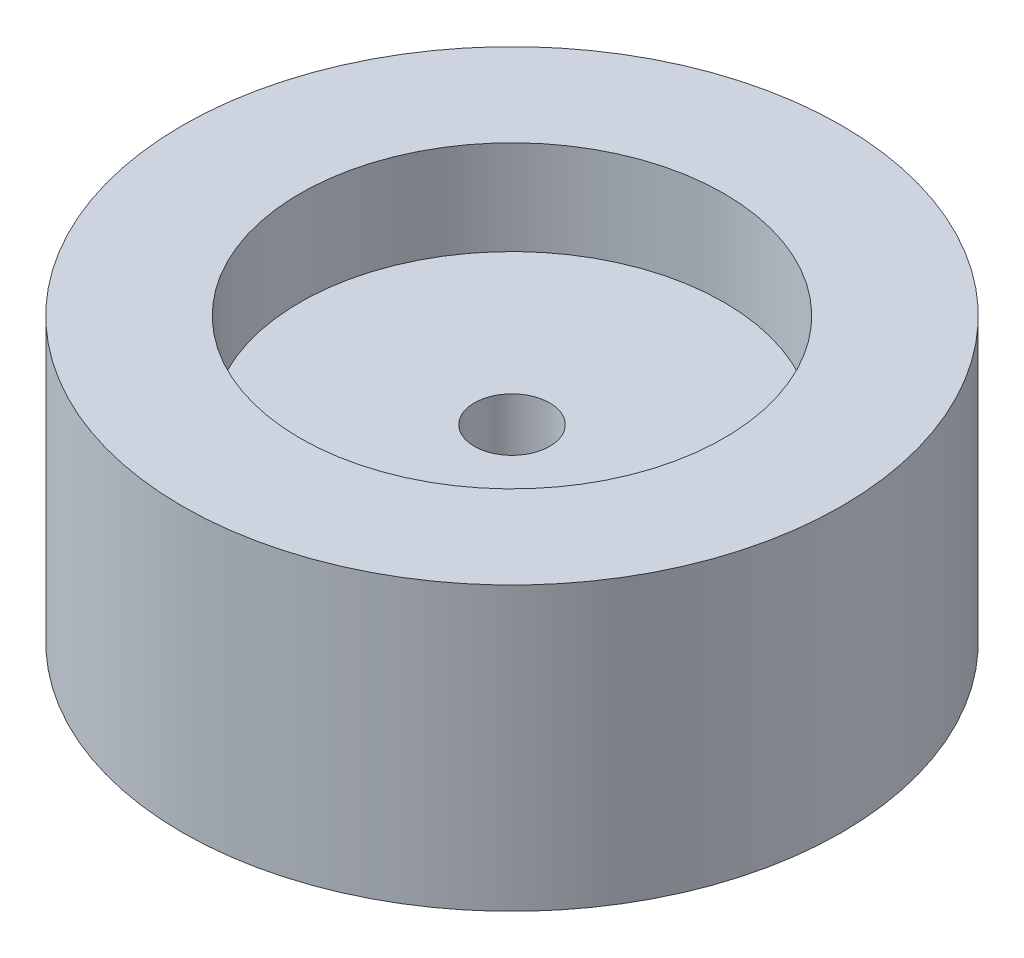
ISO-10303-21;
HEADER;
FILE_DESCRIPTION(('STEP AP214'),'2;1');
FILE_NAME('part.step','',(''),(''),'','','');
FILE_SCHEMA(('AUTOMOTIVE_DESIGN { 1 0 10303 214 1 1 1 1 }'));
ENDSEC;
DATA;
#1=APPLICATION_CONTEXT('core data for automotive mechanical design processes');
#2=APPLICATION_PROTOCOL_DEFINITION('international standard','automotive_design',2000,#1);
#3=PRODUCT_CONTEXT('',#1,'mechanical');
#4=PRODUCT('Part','Part','',(#3));
#5=PRODUCT_RELATED_PRODUCT_CATEGORY('part','',(#4));
#6=PRODUCT_DEFINITION_FORMATION('','',#4);
#7=PRODUCT_DEFINITION_CONTEXT('part definition',#1,'design');
#8=PRODUCT_DEFINITION('design','',#6,#7);
#9=PRODUCT_DEFINITION_SHAPE('','',#8);
#10=(LENGTH_UNIT() NAMED_UNIT(*) SI_UNIT(.MILLI.,.METRE.));
#11=(NAMED_UNIT(*) PLANE_ANGLE_UNIT() SI_UNIT($,.RADIAN.));
#12=(NAMED_UNIT(*) SI_UNIT($,.STERADIAN.) SOLID_ANGLE_UNIT());
#13=UNCERTAINTY_MEASURE_WITH_UNIT(LENGTH_MEASURE(1.E-05),#10,'distance_accuracy_value','');
#14=(GEOMETRIC_REPRESENTATION_CONTEXT(3) GLOBAL_UNCERTAINTY_ASSIGNED_CONTEXT((#13)) GLOBAL_UNIT_ASSIGNED_CONTEXT((#10,
#11,#12)) REPRESENTATION_CONTEXT('',''));
#15=CARTESIAN_POINT('',(0.,0.,0.));
#16=DIRECTION('',(0.,0.,1.));
#17=DIRECTION('',(1.,0.,0.));
#18=AXIS2_PLACEMENT_3D('',#15,#16,#17);
#19=CARTESIAN_POINT('',(0.,30.,0.));
#20=DIRECTION('',(0.,-1.,0.));
#21=DIRECTION('',(0.,0.,-1.));
#22=AXIS2_PLACEMENT_3D('',#19,#20,#21);
#23=CYLINDRICAL_SURFACE('',#22,35.);
#24=CARTESIAN_POINT('',(0.,30.,0.));
#25=DIRECTION('',(0.,1.,0.));
#26=DIRECTION('',(0.,0.,1.));
#27=AXIS2_PLACEMENT_3D('',#24,#25,#26);
#28=CIRCLE('',#27,35.);
#29=CARTESIAN_POINT('',(0.,30.,35.));
#30=VERTEX_POINT('',#29);
#31=EDGE_CURVE('E10',#30,#30,#28,.T.);
#32=ORIENTED_EDGE('',*,*,#31,.F.);
#33=EDGE_LOOP('',(#32));
#34=FACE_BOUND('',#33,.T.);
#35=CARTESIAN_POINT('',(0.,0.,0.));
#36=DIRECTION('',(0.,1.,0.));
#37=DIRECTION('',(0.,0.,1.));
#38=AXIS2_PLACEMENT_3D('',#35,#36,#37);
#39=CIRCLE('',#38,35.);
#40=CARTESIAN_POINT('',(0.,0.,35.));
#41=VERTEX_POINT('',#40);
#42=EDGE_CURVE('E48',#41,#41,#39,.T.);
#43=ORIENTED_EDGE('',*,*,#42,.T.);
#44=EDGE_LOOP('',(#43));
#45=FACE_BOUND('',#44,.T.);
#46=ADVANCED_FACE('F45',(#34,#45),#23,.T.);
#47=CARTESIAN_POINT('',(0.,30.,0.));
#48=DIRECTION('',(0.,1.,0.));
#49=DIRECTION('',(0.,0.,1.));
#50=AXIS2_PLACEMENT_3D('',#47,#48,#49);
#51=PLANE('',#50);
#52=CARTESIAN_POINT('',(0.,30.,0.));
#53=DIRECTION('',(0.,1.,0.));
#54=DIRECTION('',(0.,0.,1.));
#55=AXIS2_PLACEMENT_3D('',#52,#53,#54);
#56=CIRCLE('',#55,22.5);
#57=CARTESIAN_POINT('',(0.,30.,22.5));
#58=VERTEX_POINT('',#57);
#59=EDGE_CURVE('E62',#58,#58,#56,.T.);
#60=ORIENTED_EDGE('',*,*,#59,.F.);
#61=EDGE_LOOP('',(#60));
#62=FACE_BOUND('',#61,.T.);
#63=ORIENTED_EDGE('',*,*,#31,.T.);
#64=EDGE_LOOP('',(#63));
#65=FACE_BOUND('',#64,.T.);
#66=ADVANCED_FACE('F110',(#62,#65),#51,.T.);
#67=CARTESIAN_POINT('',(0.,0.,0.));
#68=DIRECTION('',(0.,1.,0.));
#69=DIRECTION('',(0.,0.,1.));
#70=AXIS2_PLACEMENT_3D('',#67,#68,#69);
#71=PLANE('',#70);
#72=CARTESIAN_POINT('',(0.,0.,0.));
#73=DIRECTION('',(0.,-1.,0.));
#74=DIRECTION('',(0.,0.,-1.));
#75=AXIS2_PLACEMENT_3D('',#72,#73,#74);
#76=CIRCLE('',#75,22.5);
#77=CARTESIAN_POINT('',(0.,0.,-22.5));
#78=VERTEX_POINT('',#77);
#79=EDGE_CURVE('E70',#78,#78,#76,.T.);
#80=ORIENTED_EDGE('',*,*,#79,.F.);
#81=EDGE_LOOP('',(#80));
#82=FACE_BOUND('',#81,.T.);
#83=ORIENTED_EDGE('',*,*,#42,.F.);
#84=EDGE_LOOP('',(#83));
#85=FACE_BOUND('',#84,.T.);
#86=ADVANCED_FACE('F106',(#82,#85),#71,.F.);
#87=CARTESIAN_POINT('',(0.,20.,0.));
#88=DIRECTION('',(0.,1.,0.));
#89=DIRECTION('',(0.,0.,1.));
#90=AXIS2_PLACEMENT_3D('',#87,#88,#89);
#91=CYLINDRICAL_SURFACE('',#90,22.5);
#92=CARTESIAN_POINT('',(0.,20.,0.));
#93=DIRECTION('',(0.,1.,0.));
#94=DIRECTION('',(0.,0.,1.));
#95=AXIS2_PLACEMENT_3D('',#92,#93,#94);
#96=CIRCLE('',#95,22.5);
#97=CARTESIAN_POINT('',(0.,20.,22.5));
#98=VERTEX_POINT('',#97);
#99=EDGE_CURVE('E60',#98,#98,#96,.T.);
#100=ORIENTED_EDGE('',*,*,#99,.F.);
#101=EDGE_LOOP('',(#100));
#102=FACE_BOUND('',#101,.T.);
#103=ORIENTED_EDGE('',*,*,#59,.T.);
#104=EDGE_LOOP('',(#103));
#105=FACE_BOUND('',#104,.T.);
#106=ADVANCED_FACE('F109',(#102,#105),#91,.F.);
#107=CARTESIAN_POINT('',(0.,20.,0.));
#108=DIRECTION('',(0.,1.,0.));
#109=DIRECTION('',(0.,0.,1.));
#110=AXIS2_PLACEMENT_3D('',#107,#108,#109);
#111=PLANE('',#110);
#112=CARTESIAN_POINT('',(0.,20.,0.));
#113=DIRECTION('',(0.,-1.,0.));
#114=DIRECTION('',(0.,0.,-1.));
#115=AXIS2_PLACEMENT_3D('',#112,#113,#114);
#116=CIRCLE('',#115,4.);
#117=CARTESIAN_POINT('',(0.,20.,-4.));
#118=VERTEX_POINT('',#117);
#119=EDGE_CURVE('E73',#118,#118,#116,.T.);
#120=ORIENTED_EDGE('',*,*,#119,.T.);
#121=EDGE_LOOP('',(#120));
#122=FACE_BOUND('',#121,.T.);
#123=ORIENTED_EDGE('',*,*,#99,.T.);
#124=EDGE_LOOP('',(#123));
#125=FACE_BOUND('',#124,.T.);
#126=ADVANCED_FACE('F85',(#122,#125),#111,.T.);
#127=CARTESIAN_POINT('',(0.,10.,0.));
#128=DIRECTION('',(0.,-1.,0.));
#129=DIRECTION('',(0.,0.,-1.));
#130=AXIS2_PLACEMENT_3D('',#127,#128,#129);
#131=CYLINDRICAL_SURFACE('',#130,22.5);
#132=CARTESIAN_POINT('',(0.,10.,0.));
#133=DIRECTION('',(0.,-1.,0.));
#134=DIRECTION('',(0.,0.,-1.));
#135=AXIS2_PLACEMENT_3D('',#132,#133,#134);
#136=CIRCLE('',#135,22.5);
#137=CARTESIAN_POINT('',(0.,10.,-22.5));
#138=VERTEX_POINT('',#137);
#139=EDGE_CURVE('E66',#138,#138,#136,.T.);
#140=ORIENTED_EDGE('',*,*,#139,.F.);
#141=EDGE_LOOP('',(#140));
#142=FACE_BOUND('',#141,.T.);
#143=ORIENTED_EDGE('',*,*,#79,.T.);
#144=EDGE_LOOP('',(#143));
#145=FACE_BOUND('',#144,.T.);
#146=ADVANCED_FACE('F97',(#142,#145),#131,.F.);
#147=CARTESIAN_POINT('',(0.,10.,0.));
#148=DIRECTION('',(0.,-1.,0.));
#149=DIRECTION('',(0.,0.,-1.));
#150=AXIS2_PLACEMENT_3D('',#147,#148,#149);
#151=PLANE('',#150);
#152=CARTESIAN_POINT('',(0.,10.,0.));
#153=DIRECTION('',(0.,-1.,0.));
#154=DIRECTION('',(0.,0.,-1.));
#155=AXIS2_PLACEMENT_3D('',#152,#153,#154);
#156=CIRCLE('',#155,4.);
#157=CARTESIAN_POINT('',(0.,10.,-4.));
#158=VERTEX_POINT('',#157);
#159=EDGE_CURVE('E76',#158,#158,#156,.T.);
#160=ORIENTED_EDGE('',*,*,#159,.F.);
#161=EDGE_LOOP('',(#160));
#162=FACE_BOUND('',#161,.T.);
#163=ORIENTED_EDGE('',*,*,#139,.T.);
#164=EDGE_LOOP('',(#163));
#165=FACE_BOUND('',#164,.T.);
#166=ADVANCED_FACE('F91',(#162,#165),#151,.T.);
#167=CARTESIAN_POINT('',(0.,20.,0.));
#168=DIRECTION('',(0.,-1.,0.));
#169=DIRECTION('',(0.,0.,-1.));
#170=AXIS2_PLACEMENT_3D('',#167,#168,#169);
#171=CYLINDRICAL_SURFACE('',#170,4.);
#172=ORIENTED_EDGE('',*,*,#119,.F.);
#173=EDGE_LOOP('',(#172));
#174=FACE_BOUND('',#173,.T.);
#175=ORIENTED_EDGE('',*,*,#159,.T.);
#176=EDGE_LOOP('',(#175));
#177=FACE_BOUND('',#176,.T.);
#178=ADVANCED_FACE('F88',(#174,#177),#171,.F.);
#179=CLOSED_SHELL('',(#46,#66,#86,#106,#126,#146,#166,#178));
#180=MANIFOLD_SOLID_BREP('B2',#179);
#181=ADVANCED_BREP_SHAPE_REPRESENTATION('',(#18,#180),#14);
#182=SHAPE_DEFINITION_REPRESENTATION(#9,#181);
ENDSEC;
END-ISO-10303-21;
